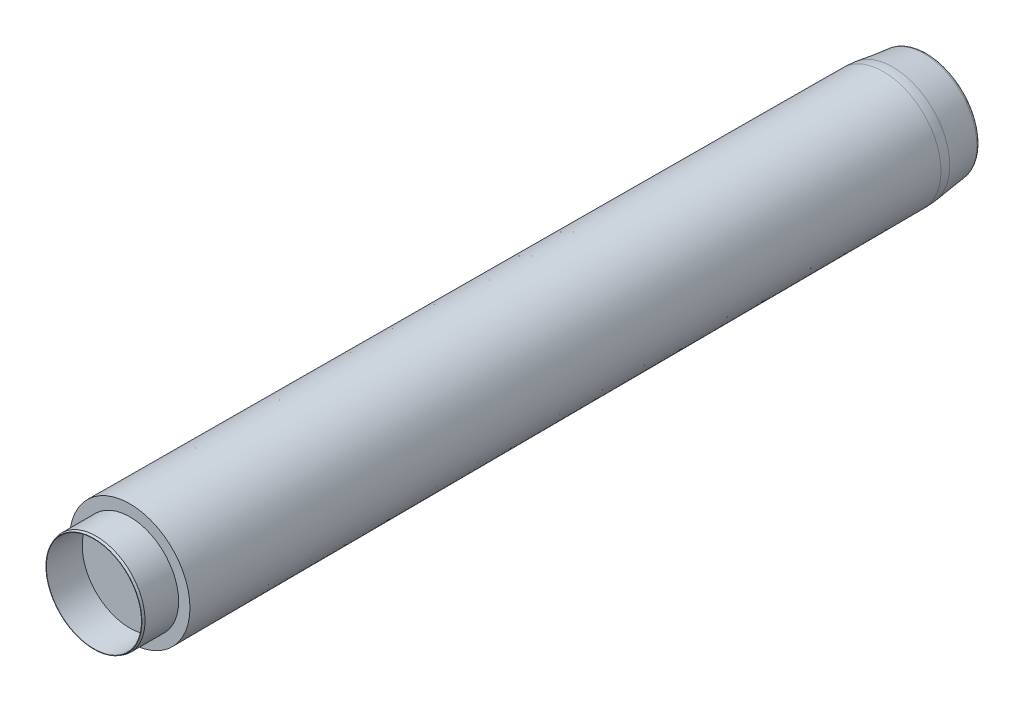
ISO-10303-21;
HEADER;
FILE_DESCRIPTION(('STEP AP214'),'2;1');
FILE_NAME('part.step','',(''),(''),'','','');
FILE_SCHEMA(('AUTOMOTIVE_DESIGN { 1 0 10303 214 1 1 1 1 }'));
ENDSEC;
DATA;
#1=APPLICATION_CONTEXT('core data for automotive mechanical design processes');
#2=APPLICATION_PROTOCOL_DEFINITION('international standard','automotive_design',2000,#1);
#3=PRODUCT_CONTEXT('',#1,'mechanical');
#4=PRODUCT('Part','Part','',(#3));
#5=PRODUCT_RELATED_PRODUCT_CATEGORY('part','',(#4));
#6=PRODUCT_DEFINITION_FORMATION('','',#4);
#7=PRODUCT_DEFINITION_CONTEXT('part definition',#1,'design');
#8=PRODUCT_DEFINITION('design','',#6,#7);
#9=PRODUCT_DEFINITION_SHAPE('','',#8);
#10=(LENGTH_UNIT() NAMED_UNIT(*) SI_UNIT(.MILLI.,.METRE.));
#11=(NAMED_UNIT(*) PLANE_ANGLE_UNIT() SI_UNIT($,.RADIAN.));
#12=(NAMED_UNIT(*) SI_UNIT($,.STERADIAN.) SOLID_ANGLE_UNIT());
#13=UNCERTAINTY_MEASURE_WITH_UNIT(LENGTH_MEASURE(1.E-05),#10,'distance_accuracy_value','');
#14=(GEOMETRIC_REPRESENTATION_CONTEXT(3) GLOBAL_UNCERTAINTY_ASSIGNED_CONTEXT((#13)) GLOBAL_UNIT_ASSIGNED_CONTEXT((#10,
#11,#12)) REPRESENTATION_CONTEXT('',''));
#15=CARTESIAN_POINT('',(0.,0.,0.));
#16=DIRECTION('',(0.,0.,1.));
#17=DIRECTION('',(1.,0.,0.));
#18=AXIS2_PLACEMENT_3D('',#15,#16,#17);
#19=CARTESIAN_POINT('',(0.,0.,0.));
#20=DIRECTION('',(0.,0.,1.));
#21=DIRECTION('',(1.,0.,0.));
#22=AXIS2_PLACEMENT_3D('',#19,#20,#21);
#23=CONICAL_SURFACE('',#22,7.7,0.00349065850398867);
#24=CARTESIAN_POINT('',(0.,0.,-96.5424308457363));
#25=DIRECTION('',(0.,0.,-1.));
#26=DIRECTION('',(-1.,0.,0.));
#27=AXIS2_PLACEMENT_3D('',#24,#25,#26);
#28=CIRCLE('',#27,7.36300197403189);
#29=CARTESIAN_POINT('',(-7.36300197403189,0.,-96.5424308457363));
#30=VERTEX_POINT('',#29);
#31=EDGE_CURVE('E54',#30,#30,#28,.F.);
#32=ORIENTED_EDGE('',*,*,#31,.T.);
#33=EDGE_LOOP('',(#32));
#34=FACE_BOUND('',#33,.T.);
#35=CARTESIAN_POINT('',(0.,0.,0.));
#36=DIRECTION('',(0.,0.,1.));
#37=DIRECTION('',(1.,0.,0.));
#38=AXIS2_PLACEMENT_3D('',#35,#36,#37);
#39=CIRCLE('',#38,7.7);
#40=CARTESIAN_POINT('',(7.7,0.,0.));
#41=VERTEX_POINT('',#40);
#42=EDGE_CURVE('E68',#41,#41,#39,.T.);
#43=ORIENTED_EDGE('',*,*,#42,.F.);
#44=EDGE_LOOP('',(#43));
#45=FACE_BOUND('',#44,.T.);
#46=ADVANCED_FACE('F38',(#34,#45),#23,.T.);
#47=CARTESIAN_POINT('',(0.,0.,-102.14));
#48=DIRECTION('',(0.,0.,1.));
#49=DIRECTION('',(1.,0.,0.));
#50=AXIS2_PLACEMENT_3D('',#47,#48,#49);
#51=PLANE('',#50);
#52=CARTESIAN_POINT('',(0.,0.,-102.14));
#53=DIRECTION('',(0.,0.,1.));
#54=DIRECTION('',(1.,0.,0.));
#55=AXIS2_PLACEMENT_3D('',#52,#53,#54);
#56=CIRCLE('',#55,6.30141028809379);
#57=CARTESIAN_POINT('',(6.30141028809379,0.,-102.14));
#58=VERTEX_POINT('',#57);
#59=EDGE_CURVE('E62',#58,#58,#56,.F.);
#60=ORIENTED_EDGE('',*,*,#59,.T.);
#61=EDGE_LOOP('',(#60));
#62=FACE_BOUND('',#61,.T.);
#63=ADVANCED_FACE('F91',(#62),#51,.F.);
#64=CARTESIAN_POINT('',(0.,0.,0.));
#65=DIRECTION('',(0.,0.,1.));
#66=DIRECTION('',(1.,0.,0.));
#67=AXIS2_PLACEMENT_3D('',#64,#65,#66);
#68=PLANE('',#67);
#69=CARTESIAN_POINT('',(0.,0.,0.));
#70=DIRECTION('',(0.,0.,1.));
#71=DIRECTION('',(1.,0.,0.));
#72=AXIS2_PLACEMENT_3D('',#69,#70,#71);
#73=CIRCLE('',#72,6.25);
#74=CARTESIAN_POINT('',(6.25,0.,0.));
#75=VERTEX_POINT('',#74);
#76=EDGE_CURVE('E71',#75,#75,#73,.T.);
#77=ORIENTED_EDGE('',*,*,#76,.F.);
#78=EDGE_LOOP('',(#77));
#79=FACE_BOUND('',#78,.T.);
#80=ORIENTED_EDGE('',*,*,#42,.T.);
#81=EDGE_LOOP('',(#80));
#82=FACE_BOUND('',#81,.T.);
#83=ADVANCED_FACE('F84',(#79,#82),#68,.T.);
#84=CARTESIAN_POINT('',(0.,0.,4.6));
#85=DIRECTION('',(0.,0.,1.));
#86=DIRECTION('',(1.,0.,0.));
#87=AXIS2_PLACEMENT_3D('',#84,#85,#86);
#88=PLANE('',#87);
#89=CARTESIAN_POINT('',(0.,0.,4.6));
#90=DIRECTION('',(0.,0.,1.));
#91=DIRECTION('',(1.,0.,0.));
#92=AXIS2_PLACEMENT_3D('',#89,#90,#91);
#93=CIRCLE('',#92,6.15000000000001);
#94=CARTESIAN_POINT('',(6.15000000000001,0.,4.6));
#95=VERTEX_POINT('',#94);
#96=EDGE_CURVE('E46',#95,#95,#93,.T.);
#97=ORIENTED_EDGE('',*,*,#96,.T.);
#98=EDGE_LOOP('',(#97));
#99=FACE_BOUND('',#98,.T.);
#100=CARTESIAN_POINT('',(0.,0.,4.6));
#101=DIRECTION('',(0.,0.,1.));
#102=DIRECTION('',(1.,0.,0.));
#103=AXIS2_PLACEMENT_3D('',#100,#101,#102);
#104=CIRCLE('',#103,6.1);
#105=CARTESIAN_POINT('',(6.1,0.,4.6));
#106=VERTEX_POINT('',#105);
#107=EDGE_CURVE('E74',#106,#106,#104,.T.);
#108=ORIENTED_EDGE('',*,*,#107,.F.);
#109=EDGE_LOOP('',(#108));
#110=FACE_BOUND('',#109,.T.);
#111=ADVANCED_FACE('F81',(#99,#110),#88,.T.);
#112=CARTESIAN_POINT('',(0.,0.,4.6));
#113=DIRECTION('',(0.,0.,-1.));
#114=DIRECTION('',(-1.,0.,0.));
#115=AXIS2_PLACEMENT_3D('',#112,#113,#114);
#116=CYLINDRICAL_SURFACE('',#115,6.25);
#117=CARTESIAN_POINT('',(0.,0.,4.30000000000002));
#118=DIRECTION('',(0.,0.,1.));
#119=DIRECTION('',(1.,0.,0.));
#120=AXIS2_PLACEMENT_3D('',#117,#118,#119);
#121=CIRCLE('',#120,6.25);
#122=CARTESIAN_POINT('',(6.25,0.,4.30000000000002));
#123=VERTEX_POINT('',#122);
#124=EDGE_CURVE('E10',#123,#123,#121,.F.);
#125=ORIENTED_EDGE('',*,*,#124,.T.);
#126=EDGE_LOOP('',(#125));
#127=FACE_BOUND('',#126,.T.);
#128=ORIENTED_EDGE('',*,*,#76,.T.);
#129=EDGE_LOOP('',(#128));
#130=FACE_BOUND('',#129,.T.);
#131=ADVANCED_FACE('F83',(#127,#130),#116,.T.);
#132=CARTESIAN_POINT('',(0.,0.,4.6));
#133=DIRECTION('',(0.,0.,-1.));
#134=DIRECTION('',(-1.,0.,0.));
#135=AXIS2_PLACEMENT_3D('',#132,#133,#134);
#136=CYLINDRICAL_SURFACE('',#135,6.1);
#137=ORIENTED_EDGE('',*,*,#107,.T.);
#138=EDGE_LOOP('',(#137));
#139=FACE_BOUND('',#138,.T.);
#140=CARTESIAN_POINT('',(0.,0.,0.));
#141=DIRECTION('',(0.,0.,1.));
#142=DIRECTION('',(1.,0.,0.));
#143=AXIS2_PLACEMENT_3D('',#140,#141,#142);
#144=CIRCLE('',#143,6.1);
#145=CARTESIAN_POINT('',(6.1,0.,0.));
#146=VERTEX_POINT('',#145);
#147=EDGE_CURVE('E65',#146,#146,#144,.F.);
#148=ORIENTED_EDGE('',*,*,#147,.T.);
#149=EDGE_LOOP('',(#148));
#150=FACE_BOUND('',#149,.T.);
#151=ADVANCED_FACE('F78',(#139,#150),#136,.F.);
#152=ORIENTED_EDGE('',*,*,#147,.F.);
#153=EDGE_LOOP('',(#152));
#154=FACE_BOUND('',#153,.T.);
#155=ADVANCED_FACE('F94',(#154),#68,.T.);
#156=CARTESIAN_POINT('',(0.,0.,-97.1400304617083));
#157=DIRECTION('',(0.,0.,1.));
#158=DIRECTION('',(1.,0.,0.));
#159=AXIS2_PLACEMENT_3D('',#156,#157,#158);
#160=CONICAL_SURFACE('',#159,7.36091594937789,0.122869332731677);
#161=CARTESIAN_POINT('',(0.,0.,-97.7331284205437));
#162=DIRECTION('',(0.,0.,-1.));
#163=DIRECTION('',(-1.,0.,0.));
#164=AXIS2_PLACEMENT_3D('',#161,#162,#163);
#165=CIRCLE('',#164,7.28767344986989);
#166=CARTESIAN_POINT('',(-7.28767344986989,0.,-97.7331284205437));
#167=VERTEX_POINT('',#166);
#168=EDGE_CURVE('E50',#167,#167,#165,.T.);
#169=ORIENTED_EDGE('',*,*,#168,.T.);
#170=EDGE_LOOP('',(#169));
#171=FACE_BOUND('',#170,.T.);
#172=CARTESIAN_POINT('',(0.,0.,-101.701280204448));
#173=DIRECTION('',(0.,0.,1.));
#174=DIRECTION('',(1.,0.,0.));
#175=AXIS2_PLACEMENT_3D('',#172,#173,#174);
#176=CIRCLE('',#175,6.79764081571458);
#177=CARTESIAN_POINT('',(6.79764081571458,0.,-101.701280204448));
#178=VERTEX_POINT('',#177);
#179=EDGE_CURVE('E59',#178,#178,#176,.T.);
#180=ORIENTED_EDGE('',*,*,#179,.T.);
#181=EDGE_LOOP('',(#180));
#182=FACE_BOUND('',#181,.T.);
#183=ADVANCED_FACE('F107',(#171,#182),#160,.T.);
#184=CARTESIAN_POINT('',(0.,0.,-101.64));
#185=DIRECTION('',(0.,0.,1.));
#186=DIRECTION('',(1.,0.,0.));
#187=AXIS2_PLACEMENT_3D('',#184,#185,#186);
#188=TOROIDAL_SURFACE('',#187,6.30141028809379,0.5);
#189=ORIENTED_EDGE('',*,*,#179,.F.);
#190=EDGE_LOOP('',(#189));
#191=FACE_BOUND('',#190,.T.);
#192=ORIENTED_EDGE('',*,*,#59,.F.);
#193=EDGE_LOOP('',(#192));
#194=FACE_BOUND('',#193,.T.);
#195=ADVANCED_FACE('F112',(#191,#194),#188,.T.);
#196=CARTESIAN_POINT('',(0.,0.,-96.5075243315839));
#197=DIRECTION('',(0.,0.,-1.));
#198=DIRECTION('',(-1.,0.,0.));
#199=AXIS2_PLACEMENT_3D('',#196,#197,#198);
#200=DEGENERATE_TOROIDAL_SURFACE('',#199,2.63693710254601,10.,.F.);
#201=ORIENTED_EDGE('',*,*,#168,.F.);
#202=EDGE_LOOP('',(#201));
#203=FACE_BOUND('',#202,.T.);
#204=ORIENTED_EDGE('',*,*,#31,.F.);
#205=EDGE_LOOP('',(#204));
#206=FACE_BOUND('',#205,.T.);
#207=ADVANCED_FACE('F115',(#203,#206),#200,.F.);
#208=CARTESIAN_POINT('',(0.,0.,4.6));
#209=DIRECTION('',(0.,0.,-1.));
#210=DIRECTION('',(-1.,0.,0.));
#211=AXIS2_PLACEMENT_3D('',#208,#209,#210);
#212=CONICAL_SURFACE('',#211,6.15000000000001,0.321750554396637);
#213=ORIENTED_EDGE('',*,*,#124,.F.);
#214=EDGE_LOOP('',(#213));
#215=FACE_BOUND('',#214,.T.);
#216=ORIENTED_EDGE('',*,*,#96,.F.);
#217=EDGE_LOOP('',(#216));
#218=FACE_BOUND('',#217,.T.);
#219=ADVANCED_FACE('F41',(#215,#218),#212,.T.);
#220=CLOSED_SHELL('',(#46,#63,#83,#111,#131,#151,#155,#183,#195,#207,#219));
#221=MANIFOLD_SOLID_BREP('B2',#220);
#222=ADVANCED_BREP_SHAPE_REPRESENTATION('',(#18,#221),#14);
#223=SHAPE_DEFINITION_REPRESENTATION(#9,#222);
ENDSEC;
END-ISO-10303-21;
